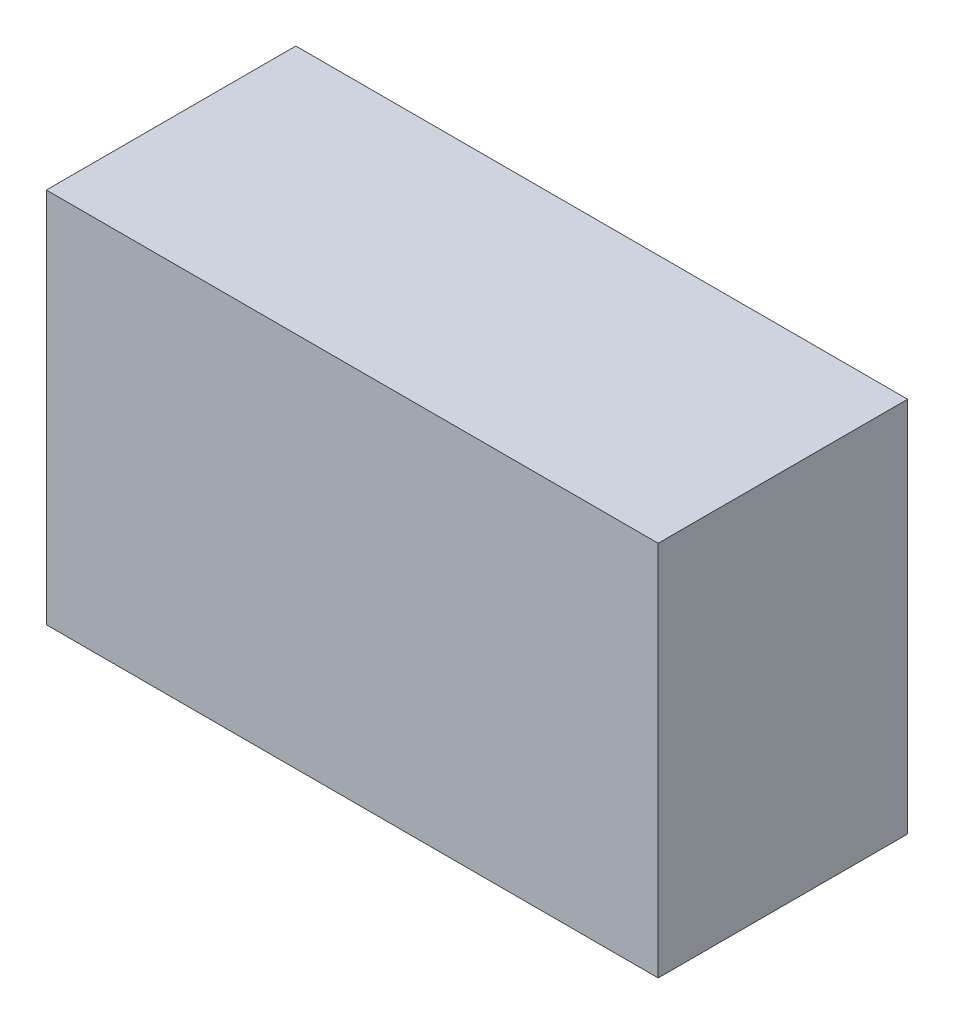
ISO-10303-21;
HEADER;
FILE_DESCRIPTION(('STEP AP214'),'2;1');
FILE_NAME('part.step','',(''),(''),'','','');
FILE_SCHEMA(('AUTOMOTIVE_DESIGN { 1 0 10303 214 1 1 1 1 }'));
ENDSEC;
DATA;
#1=APPLICATION_CONTEXT('core data for automotive mechanical design processes');
#2=APPLICATION_PROTOCOL_DEFINITION('international standard','automotive_design',2000,#1);
#3=PRODUCT_CONTEXT('',#1,'mechanical');
#4=PRODUCT('Part','Part','',(#3));
#5=PRODUCT_RELATED_PRODUCT_CATEGORY('part','',(#4));
#6=PRODUCT_DEFINITION_FORMATION('','',#4);
#7=PRODUCT_DEFINITION_CONTEXT('part definition',#1,'design');
#8=PRODUCT_DEFINITION('design','',#6,#7);
#9=PRODUCT_DEFINITION_SHAPE('','',#8);
#10=(LENGTH_UNIT() NAMED_UNIT(*) SI_UNIT(.MILLI.,.METRE.));
#11=(NAMED_UNIT(*) PLANE_ANGLE_UNIT() SI_UNIT($,.RADIAN.));
#12=(NAMED_UNIT(*) SI_UNIT($,.STERADIAN.) SOLID_ANGLE_UNIT());
#13=UNCERTAINTY_MEASURE_WITH_UNIT(LENGTH_MEASURE(1.E-05),#10,'distance_accuracy_value','');
#14=(GEOMETRIC_REPRESENTATION_CONTEXT(3) GLOBAL_UNCERTAINTY_ASSIGNED_CONTEXT((#13)) GLOBAL_UNIT_ASSIGNED_CONTEXT((#10,
#11,#12)) REPRESENTATION_CONTEXT('',''));
#15=CARTESIAN_POINT('',(0.,0.,0.));
#16=DIRECTION('',(0.,0.,1.));
#17=DIRECTION('',(1.,0.,0.));
#18=AXIS2_PLACEMENT_3D('',#15,#16,#17);
#19=CARTESIAN_POINT('',(-23.6607142857143,40.,-12.4553571428571));
#20=DIRECTION('',(1.,0.,0.));
#21=DIRECTION('',(0.,0.,-1.));
#22=AXIS2_PLACEMENT_3D('',#19,#20,#21);
#23=PLANE('',#22);
#24=DIRECTION('',(0.,0.,1.));
#25=VECTOR('',#24,1.);
#26=CARTESIAN_POINT('',(-23.6607142857143,0.,-12.4553571428571));
#27=LINE('',#26,#25);
#28=CARTESIAN_POINT('',(-23.6607142857143,0.,-12.4553571428571));
#29=VERTEX_POINT('',#28);
#30=CARTESIAN_POINT('',(-23.6607142857143,0.,14.0446428571429));
#31=VERTEX_POINT('',#30);
#32=EDGE_CURVE('E113',#29,#31,#27,.T.);
#33=ORIENTED_EDGE('',*,*,#32,.T.);
#34=DIRECTION('',(0.,-1.,0.));
#35=VECTOR('',#34,1.);
#36=CARTESIAN_POINT('',(-23.6607142857143,40.,14.0446428571429));
#37=LINE('',#36,#35);
#38=CARTESIAN_POINT('',(-23.6607142857143,40.,14.0446428571429));
#39=VERTEX_POINT('',#38);
#40=EDGE_CURVE('E11',#39,#31,#37,.T.);
#41=ORIENTED_EDGE('',*,*,#40,.F.);
#42=DIRECTION('',(0.,0.,1.));
#43=VECTOR('',#42,1.);
#44=CARTESIAN_POINT('',(-23.6607142857143,40.,-12.4553571428571));
#45=LINE('',#44,#43);
#46=CARTESIAN_POINT('',(-23.6607142857143,40.,-12.4553571428571));
#47=VERTEX_POINT('',#46);
#48=EDGE_CURVE('E95',#47,#39,#45,.T.);
#49=ORIENTED_EDGE('',*,*,#48,.F.);
#50=DIRECTION('',(0.,-1.,0.));
#51=VECTOR('',#50,1.);
#52=CARTESIAN_POINT('',(-23.6607142857143,40.,-12.4553571428571));
#53=LINE('',#52,#51);
#54=EDGE_CURVE('E62',#47,#29,#53,.T.);
#55=ORIENTED_EDGE('',*,*,#54,.T.);
#56=EDGE_LOOP('',(#33,#41,#49,#55));
#57=FACE_BOUND('',#56,.T.);
#58=ADVANCED_FACE('F45',(#57),#23,.F.);
#59=CARTESIAN_POINT('',(-23.6607142857143,40.,14.0446428571429));
#60=DIRECTION('',(0.,0.,-1.));
#61=DIRECTION('',(-1.,0.,0.));
#62=AXIS2_PLACEMENT_3D('',#59,#60,#61);
#63=PLANE('',#62);
#64=DIRECTION('',(1.,0.,0.));
#65=VECTOR('',#64,1.);
#66=CARTESIAN_POINT('',(-23.6607142857143,0.,14.0446428571429));
#67=LINE('',#66,#65);
#68=CARTESIAN_POINT('',(41.3392857142857,0.,14.0446428571429));
#69=VERTEX_POINT('',#68);
#70=EDGE_CURVE('E101',#31,#69,#67,.T.);
#71=ORIENTED_EDGE('',*,*,#70,.T.);
#72=DIRECTION('',(0.,-1.,0.));
#73=VECTOR('',#72,1.);
#74=CARTESIAN_POINT('',(41.3392857142857,40.,14.0446428571429));
#75=LINE('',#74,#73);
#76=CARTESIAN_POINT('',(41.3392857142857,40.,14.0446428571429));
#77=VERTEX_POINT('',#76);
#78=EDGE_CURVE('E54',#77,#69,#75,.T.);
#79=ORIENTED_EDGE('',*,*,#78,.F.);
#80=DIRECTION('',(1.,0.,0.));
#81=VECTOR('',#80,1.);
#82=CARTESIAN_POINT('',(-23.6607142857143,40.,14.0446428571429));
#83=LINE('',#82,#81);
#84=EDGE_CURVE('E87',#39,#77,#83,.T.);
#85=ORIENTED_EDGE('',*,*,#84,.F.);
#86=ORIENTED_EDGE('',*,*,#40,.T.);
#87=EDGE_LOOP('',(#71,#79,#85,#86));
#88=FACE_BOUND('',#87,.T.);
#89=ADVANCED_FACE('F100',(#88),#63,.F.);
#90=CARTESIAN_POINT('',(41.3392857142857,40.,-12.4553571428571));
#91=DIRECTION('',(1.,0.,0.));
#92=DIRECTION('',(0.,0.,-1.));
#93=AXIS2_PLACEMENT_3D('',#90,#91,#92);
#94=PLANE('',#93);
#95=DIRECTION('',(0.,0.,1.));
#96=VECTOR('',#95,1.);
#97=CARTESIAN_POINT('',(41.3392857142857,0.,-12.4553571428571));
#98=LINE('',#97,#96);
#99=CARTESIAN_POINT('',(41.3392857142857,0.,-12.4553571428571));
#100=VERTEX_POINT('',#99);
#101=EDGE_CURVE('E118',#100,#69,#98,.T.);
#102=ORIENTED_EDGE('',*,*,#101,.F.);
#103=DIRECTION('',(0.,-1.,0.));
#104=VECTOR('',#103,1.);
#105=CARTESIAN_POINT('',(41.3392857142857,40.,-12.4553571428571));
#106=LINE('',#105,#104);
#107=CARTESIAN_POINT('',(41.3392857142857,40.,-12.4553571428571));
#108=VERTEX_POINT('',#107);
#109=EDGE_CURVE('E76',#108,#100,#106,.T.);
#110=ORIENTED_EDGE('',*,*,#109,.F.);
#111=DIRECTION('',(0.,0.,1.));
#112=VECTOR('',#111,1.);
#113=CARTESIAN_POINT('',(41.3392857142857,40.,-12.4553571428571));
#114=LINE('',#113,#112);
#115=EDGE_CURVE('E94',#108,#77,#114,.T.);
#116=ORIENTED_EDGE('',*,*,#115,.T.);
#117=ORIENTED_EDGE('',*,*,#78,.T.);
#118=EDGE_LOOP('',(#102,#110,#116,#117));
#119=FACE_BOUND('',#118,.T.);
#120=ADVANCED_FACE('F105',(#119),#94,.T.);
#121=CARTESIAN_POINT('',(-23.6607142857143,40.,-12.4553571428571));
#122=DIRECTION('',(0.,0.,-1.));
#123=DIRECTION('',(-1.,0.,0.));
#124=AXIS2_PLACEMENT_3D('',#121,#122,#123);
#125=PLANE('',#124);
#126=DIRECTION('',(1.,0.,0.));
#127=VECTOR('',#126,1.);
#128=CARTESIAN_POINT('',(-23.6607142857143,0.,-12.4553571428571));
#129=LINE('',#128,#127);
#130=EDGE_CURVE('E121',#29,#100,#129,.T.);
#131=ORIENTED_EDGE('',*,*,#130,.F.);
#132=ORIENTED_EDGE('',*,*,#54,.F.);
#133=DIRECTION('',(1.,0.,0.));
#134=VECTOR('',#133,1.);
#135=CARTESIAN_POINT('',(-23.6607142857143,40.,-12.4553571428571));
#136=LINE('',#135,#134);
#137=EDGE_CURVE('E107',#47,#108,#136,.T.);
#138=ORIENTED_EDGE('',*,*,#137,.T.);
#139=ORIENTED_EDGE('',*,*,#109,.T.);
#140=EDGE_LOOP('',(#131,#132,#138,#139));
#141=FACE_BOUND('',#140,.T.);
#142=ADVANCED_FACE('F131',(#141),#125,.T.);
#143=CARTESIAN_POINT('',(0.,40.,0.));
#144=DIRECTION('',(0.,1.,0.));
#145=DIRECTION('',(0.,0.,1.));
#146=AXIS2_PLACEMENT_3D('',#143,#144,#145);
#147=PLANE('',#146);
#148=ORIENTED_EDGE('',*,*,#48,.T.);
#149=ORIENTED_EDGE('',*,*,#84,.T.);
#150=ORIENTED_EDGE('',*,*,#115,.F.);
#151=ORIENTED_EDGE('',*,*,#137,.F.);
#152=EDGE_LOOP('',(#148,#149,#150,#151));
#153=FACE_BOUND('',#152,.T.);
#154=ADVANCED_FACE('F91',(#153),#147,.T.);
#155=CARTESIAN_POINT('',(0.,0.,0.));
#156=DIRECTION('',(0.,1.,0.));
#157=DIRECTION('',(0.,0.,1.));
#158=AXIS2_PLACEMENT_3D('',#155,#156,#157);
#159=PLANE('',#158);
#160=ORIENTED_EDGE('',*,*,#32,.F.);
#161=ORIENTED_EDGE('',*,*,#130,.T.);
#162=ORIENTED_EDGE('',*,*,#101,.T.);
#163=ORIENTED_EDGE('',*,*,#70,.F.);
#164=EDGE_LOOP('',(#160,#161,#162,#163));
#165=FACE_BOUND('',#164,.T.);
#166=ADVANCED_FACE('F130',(#165),#159,.F.);
#167=CLOSED_SHELL('',(#58,#89,#120,#142,#154,#166));
#168=MANIFOLD_SOLID_BREP('B2',#167);
#169=ADVANCED_BREP_SHAPE_REPRESENTATION('',(#18,#168),#14);
#170=SHAPE_DEFINITION_REPRESENTATION(#9,#169);
ENDSEC;
END-ISO-10303-21;
